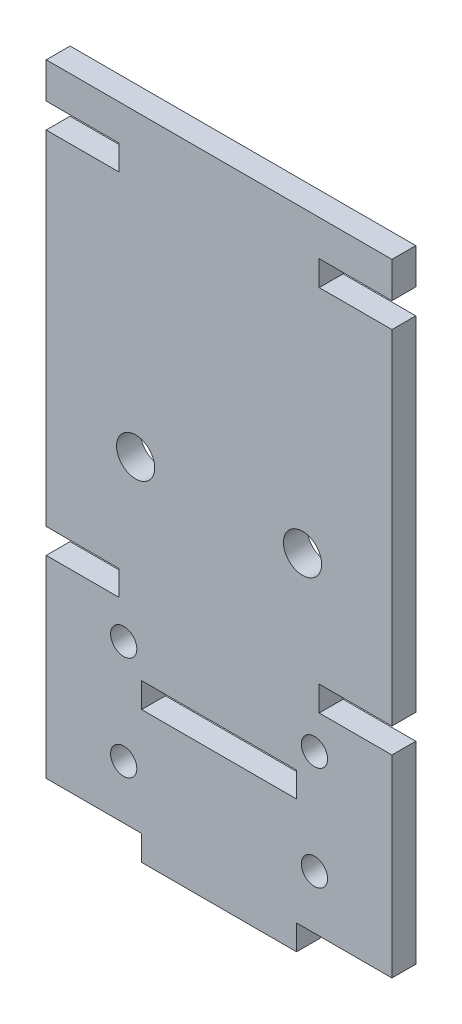
ISO-10303-21;
HEADER;
FILE_DESCRIPTION(('STEP AP214'),'2;1');
FILE_NAME('part.step','',(''),(''),'','','');
FILE_SCHEMA(('AUTOMOTIVE_DESIGN { 1 0 10303 214 1 1 1 1 }'));
ENDSEC;
DATA;
#1=APPLICATION_CONTEXT('core data for automotive mechanical design processes');
#2=APPLICATION_PROTOCOL_DEFINITION('international standard','automotive_design',2000,#1);
#3=PRODUCT_CONTEXT('',#1,'mechanical');
#4=PRODUCT('Part','Part','',(#3));
#5=PRODUCT_RELATED_PRODUCT_CATEGORY('part','',(#4));
#6=PRODUCT_DEFINITION_FORMATION('','',#4);
#7=PRODUCT_DEFINITION_CONTEXT('part definition',#1,'design');
#8=PRODUCT_DEFINITION('design','',#6,#7);
#9=PRODUCT_DEFINITION_SHAPE('','',#8);
#10=(LENGTH_UNIT() NAMED_UNIT(*) SI_UNIT(.MILLI.,.METRE.));
#11=(NAMED_UNIT(*) PLANE_ANGLE_UNIT() SI_UNIT($,.RADIAN.));
#12=(NAMED_UNIT(*) SI_UNIT($,.STERADIAN.) SOLID_ANGLE_UNIT());
#13=UNCERTAINTY_MEASURE_WITH_UNIT(LENGTH_MEASURE(1.E-05),#10,'distance_accuracy_value','');
#14=(GEOMETRIC_REPRESENTATION_CONTEXT(3) GLOBAL_UNCERTAINTY_ASSIGNED_CONTEXT((#13)) GLOBAL_UNIT_ASSIGNED_CONTEXT((#10,
#11,#12)) REPRESENTATION_CONTEXT('',''));
#15=CARTESIAN_POINT('',(0.,0.,0.));
#16=DIRECTION('',(0.,0.,1.));
#17=DIRECTION('',(1.,0.,0.));
#18=AXIS2_PLACEMENT_3D('',#15,#16,#17);
#19=CARTESIAN_POINT('',(0.,31.3004716981132,2.));
#20=DIRECTION('',(0.,-1.,0.));
#21=DIRECTION('',(0.,0.,-1.));
#22=AXIS2_PLACEMENT_3D('',#19,#20,#21);
#23=PLANE('',#22);
#24=DIRECTION('',(0.,0.,1.));
#25=VECTOR('',#24,1.);
#26=CARTESIAN_POINT('',(-6.14292452830189,31.3004716981132,0.));
#27=LINE('',#26,#25);
#28=CARTESIAN_POINT('',(-6.14292452830189,31.3004716981132,0.));
#29=VERTEX_POINT('',#28);
#30=CARTESIAN_POINT('',(-6.14292452830189,31.3004716981132,2.));
#31=VERTEX_POINT('',#30);
#32=EDGE_CURVE('E318',#29,#31,#27,.T.);
#33=ORIENTED_EDGE('',*,*,#32,.F.);
#34=DIRECTION('',(-1.,0.,0.));
#35=VECTOR('',#34,1.);
#36=CARTESIAN_POINT('',(0.,31.3004716981132,0.));
#37=LINE('',#36,#35);
#38=CARTESIAN_POINT('',(-12.2429245283019,31.3004716981132,0.));
#39=VERTEX_POINT('',#38);
#40=EDGE_CURVE('E429',#29,#39,#37,.T.);
#41=ORIENTED_EDGE('',*,*,#40,.T.);
#42=DIRECTION('',(0.,0.,-1.));
#43=VECTOR('',#42,1.);
#44=CARTESIAN_POINT('',(-12.2429245283019,31.3004716981132,2.));
#45=LINE('',#44,#43);
#46=CARTESIAN_POINT('',(-12.2429245283019,31.3004716981132,2.));
#47=VERTEX_POINT('',#46);
#48=EDGE_CURVE('E411',#47,#39,#45,.T.);
#49=ORIENTED_EDGE('',*,*,#48,.F.);
#50=DIRECTION('',(-1.,0.,0.));
#51=VECTOR('',#50,1.);
#52=CARTESIAN_POINT('',(0.,31.3004716981132,2.));
#53=LINE('',#52,#51);
#54=EDGE_CURVE('E395',#31,#47,#53,.T.);
#55=ORIENTED_EDGE('',*,*,#54,.F.);
#56=EDGE_LOOP('',(#33,#41,#49,#55));
#57=FACE_BOUND('',#56,.T.);
#58=ADVANCED_FACE('F45',(#57),#23,.F.);
#59=CARTESIAN_POINT('',(-12.2429245283019,0.,2.));
#60=DIRECTION('',(1.,0.,0.));
#61=DIRECTION('',(0.,1.,0.));
#62=AXIS2_PLACEMENT_3D('',#59,#60,#61);
#63=PLANE('',#62);
#64=DIRECTION('',(0.,0.,1.));
#65=VECTOR('',#64,1.);
#66=CARTESIAN_POINT('',(-12.2429245283019,0.400471698113226,0.));
#67=LINE('',#66,#65);
#68=CARTESIAN_POINT('',(-12.2429245283019,0.400471698113226,0.));
#69=VERTEX_POINT('',#68);
#70=CARTESIAN_POINT('',(-12.2429245283019,0.400471698113226,2.));
#71=VERTEX_POINT('',#70);
#72=EDGE_CURVE('E350',#69,#71,#67,.T.);
#73=ORIENTED_EDGE('',*,*,#72,.F.);
#74=DIRECTION('',(0.,-1.,0.));
#75=VECTOR('',#74,1.);
#76=CARTESIAN_POINT('',(-12.2429245283019,0.,0.));
#77=LINE('',#76,#75);
#78=CARTESIAN_POINT('',(-12.2429245283019,-15.7995283018868,0.));
#79=VERTEX_POINT('',#78);
#80=EDGE_CURVE('E348',#69,#79,#77,.T.);
#81=ORIENTED_EDGE('',*,*,#80,.T.);
#82=DIRECTION('',(0.,0.,-1.));
#83=VECTOR('',#82,1.);
#84=CARTESIAN_POINT('',(-12.2429245283019,-15.7995283018868,2.));
#85=LINE('',#84,#83);
#86=CARTESIAN_POINT('',(-12.2429245283019,-15.7995283018868,2.));
#87=VERTEX_POINT('',#86);
#88=EDGE_CURVE('E449',#87,#79,#85,.T.);
#89=ORIENTED_EDGE('',*,*,#88,.F.);
#90=DIRECTION('',(0.,-1.,0.));
#91=VECTOR('',#90,1.);
#92=CARTESIAN_POINT('',(-12.2429245283019,0.,2.));
#93=LINE('',#92,#91);
#94=EDGE_CURVE('E382',#71,#87,#93,.T.);
#95=ORIENTED_EDGE('',*,*,#94,.F.);
#96=EDGE_LOOP('',(#73,#81,#89,#95));
#97=FACE_BOUND('',#96,.T.);
#98=ADVANCED_FACE('F494',(#97),#63,.F.);
#99=CARTESIAN_POINT('',(16.7570754716981,0.,2.));
#100=DIRECTION('',(-1.,0.,0.));
#101=DIRECTION('',(0.,-1.,0.));
#102=AXIS2_PLACEMENT_3D('',#99,#100,#101);
#103=PLANE('',#102);
#104=DIRECTION('',(0.,1.,0.));
#105=VECTOR('',#104,1.);
#106=CARTESIAN_POINT('',(16.7570754716981,0.,2.));
#107=LINE('',#106,#105);
#108=CARTESIAN_POINT('',(16.7570754716981,2.50047169811322,2.));
#109=VERTEX_POINT('',#108);
#110=CARTESIAN_POINT('',(16.7570754716981,31.3004716981132,2.));
#111=VERTEX_POINT('',#110);
#112=EDGE_CURVE('E396',#109,#111,#107,.T.);
#113=ORIENTED_EDGE('',*,*,#112,.F.);
#114=DIRECTION('',(0.,0.,1.));
#115=VECTOR('',#114,1.);
#116=CARTESIAN_POINT('',(16.7570754716981,2.50047169811322,0.));
#117=LINE('',#116,#115);
#118=CARTESIAN_POINT('',(16.7570754716981,2.50047169811322,0.));
#119=VERTEX_POINT('',#118);
#120=EDGE_CURVE('E328',#119,#109,#117,.T.);
#121=ORIENTED_EDGE('',*,*,#120,.F.);
#122=DIRECTION('',(0.,1.,0.));
#123=VECTOR('',#122,1.);
#124=CARTESIAN_POINT('',(16.7570754716981,0.,0.));
#125=LINE('',#124,#123);
#126=CARTESIAN_POINT('',(16.7570754716981,31.3004716981132,0.));
#127=VERTEX_POINT('',#126);
#128=EDGE_CURVE('E430',#119,#127,#125,.T.);
#129=ORIENTED_EDGE('',*,*,#128,.T.);
#130=DIRECTION('',(0.,0.,-1.));
#131=VECTOR('',#130,1.);
#132=CARTESIAN_POINT('',(16.7570754716981,31.3004716981132,2.));
#133=LINE('',#132,#131);
#134=EDGE_CURVE('E454',#111,#127,#133,.T.);
#135=ORIENTED_EDGE('',*,*,#134,.F.);
#136=EDGE_LOOP('',(#113,#121,#129,#135));
#137=FACE_BOUND('',#136,.T.);
#138=ADVANCED_FACE('F503',(#137),#103,.F.);
#139=CARTESIAN_POINT('',(0.,-4.69952830188677,2.));
#140=DIRECTION('',(0.,-1.,0.));
#141=DIRECTION('',(0.,0.,-1.));
#142=AXIS2_PLACEMENT_3D('',#139,#140,#141);
#143=PLANE('',#142);
#144=DIRECTION('',(-1.,0.,0.));
#145=VECTOR('',#144,1.);
#146=CARTESIAN_POINT('',(0.,-4.69952830188677,0.));
#147=LINE('',#146,#145);
#148=CARTESIAN_POINT('',(8.7570754716981,-4.69952830188677,0.));
#149=VERTEX_POINT('',#148);
#150=CARTESIAN_POINT('',(-4.24292452830188,-4.69952830188677,0.));
#151=VERTEX_POINT('',#150);
#152=EDGE_CURVE('E434',#149,#151,#147,.T.);
#153=ORIENTED_EDGE('',*,*,#152,.F.);
#154=DIRECTION('',(0.,0.,-1.));
#155=VECTOR('',#154,1.);
#156=CARTESIAN_POINT('',(8.7570754716981,-4.69952830188677,2.));
#157=LINE('',#156,#155);
#158=CARTESIAN_POINT('',(8.7570754716981,-4.69952830188677,2.));
#159=VERTEX_POINT('',#158);
#160=EDGE_CURVE('E11',#159,#149,#157,.T.);
#161=ORIENTED_EDGE('',*,*,#160,.F.);
#162=DIRECTION('',(-1.,0.,0.));
#163=VECTOR('',#162,1.);
#164=CARTESIAN_POINT('',(0.,-4.69952830188677,2.));
#165=LINE('',#164,#163);
#166=CARTESIAN_POINT('',(-4.24292452830188,-4.69952830188677,2.));
#167=VERTEX_POINT('',#166);
#168=EDGE_CURVE('E400',#159,#167,#165,.T.);
#169=ORIENTED_EDGE('',*,*,#168,.T.);
#170=DIRECTION('',(0.,0.,-1.));
#171=VECTOR('',#170,1.);
#172=CARTESIAN_POINT('',(-4.24292452830188,-4.69952830188677,2.));
#173=LINE('',#172,#171);
#174=EDGE_CURVE('E446',#167,#151,#173,.T.);
#175=ORIENTED_EDGE('',*,*,#174,.T.);
#176=EDGE_LOOP('',(#153,#161,#169,#175));
#177=FACE_BOUND('',#176,.T.);
#178=ADVANCED_FACE('F780',(#177),#143,.T.);
#179=CARTESIAN_POINT('',(8.7570754716981,0.,2.));
#180=DIRECTION('',(1.,0.,0.));
#181=DIRECTION('',(0.,0.,-1.));
#182=AXIS2_PLACEMENT_3D('',#179,#180,#181);
#183=PLANE('',#182);
#184=DIRECTION('',(0.,-1.,0.));
#185=VECTOR('',#184,1.);
#186=CARTESIAN_POINT('',(8.7570754716981,0.,0.));
#187=LINE('',#186,#185);
#188=CARTESIAN_POINT('',(8.7570754716981,-6.79952830188677,0.));
#189=VERTEX_POINT('',#188);
#190=EDGE_CURVE('E437',#149,#189,#187,.T.);
#191=ORIENTED_EDGE('',*,*,#190,.T.);
#192=DIRECTION('',(0.,0.,-1.));
#193=VECTOR('',#192,1.);
#194=CARTESIAN_POINT('',(8.7570754716981,-6.79952830188677,2.));
#195=LINE('',#194,#193);
#196=CARTESIAN_POINT('',(8.7570754716981,-6.79952830188677,2.));
#197=VERTEX_POINT('',#196);
#198=EDGE_CURVE('E54',#197,#189,#195,.T.);
#199=ORIENTED_EDGE('',*,*,#198,.F.);
#200=DIRECTION('',(0.,-1.,0.));
#201=VECTOR('',#200,1.);
#202=CARTESIAN_POINT('',(8.7570754716981,0.,2.));
#203=LINE('',#202,#201);
#204=EDGE_CURVE('E403',#159,#197,#203,.T.);
#205=ORIENTED_EDGE('',*,*,#204,.F.);
#206=ORIENTED_EDGE('',*,*,#160,.T.);
#207=EDGE_LOOP('',(#191,#199,#205,#206));
#208=FACE_BOUND('',#207,.T.);
#209=ADVANCED_FACE('F871',(#208),#183,.F.);
#210=CARTESIAN_POINT('',(0.,-6.79952830188677,2.));
#211=DIRECTION('',(0.,1.,0.));
#212=DIRECTION('',(0.,0.,1.));
#213=AXIS2_PLACEMENT_3D('',#210,#211,#212);
#214=PLANE('',#213);
#215=DIRECTION('',(1.,0.,0.));
#216=VECTOR('',#215,1.);
#217=CARTESIAN_POINT('',(0.,-6.79952830188677,0.));
#218=LINE('',#217,#216);
#219=CARTESIAN_POINT('',(-4.24292452830188,-6.79952830188677,0.));
#220=VERTEX_POINT('',#219);
#221=EDGE_CURVE('E440',#220,#189,#218,.T.);
#222=ORIENTED_EDGE('',*,*,#221,.F.);
#223=DIRECTION('',(0.,0.,-1.));
#224=VECTOR('',#223,1.);
#225=CARTESIAN_POINT('',(-4.24292452830188,-6.79952830188677,2.));
#226=LINE('',#225,#224);
#227=CARTESIAN_POINT('',(-4.24292452830188,-6.79952830188677,2.));
#228=VERTEX_POINT('',#227);
#229=EDGE_CURVE('E448',#228,#220,#226,.T.);
#230=ORIENTED_EDGE('',*,*,#229,.F.);
#231=DIRECTION('',(1.,0.,0.));
#232=VECTOR('',#231,1.);
#233=CARTESIAN_POINT('',(0.,-6.79952830188677,2.));
#234=LINE('',#233,#232);
#235=EDGE_CURVE('E405',#228,#197,#234,.T.);
#236=ORIENTED_EDGE('',*,*,#235,.T.);
#237=ORIENTED_EDGE('',*,*,#198,.T.);
#238=EDGE_LOOP('',(#222,#230,#236,#237));
#239=FACE_BOUND('',#238,.T.);
#240=ADVANCED_FACE('F862',(#239),#214,.T.);
#241=CARTESIAN_POINT('',(-12.2429245283019,2.50047169811322,0.));
#242=VERTEX_POINT('',#241);
#243=EDGE_CURVE('E412',#39,#242,#77,.T.);
#244=ORIENTED_EDGE('',*,*,#243,.T.);
#245=DIRECTION('',(0.,0.,1.));
#246=VECTOR('',#245,1.);
#247=CARTESIAN_POINT('',(-12.2429245283019,2.50047169811322,0.));
#248=LINE('',#247,#246);
#249=CARTESIAN_POINT('',(-12.2429245283019,2.50047169811322,2.));
#250=VERTEX_POINT('',#249);
#251=EDGE_CURVE('E337',#242,#250,#248,.T.);
#252=ORIENTED_EDGE('',*,*,#251,.T.);
#253=EDGE_CURVE('E378',#47,#250,#93,.T.);
#254=ORIENTED_EDGE('',*,*,#253,.F.);
#255=ORIENTED_EDGE('',*,*,#48,.T.);
#256=EDGE_LOOP('',(#244,#252,#254,#255));
#257=FACE_BOUND('',#256,.T.);
#258=ADVANCED_FACE('F47',(#257),#63,.F.);
#259=CARTESIAN_POINT('',(0.,-15.7995283018868,2.));
#260=DIRECTION('',(0.,1.,0.));
#261=DIRECTION('',(-1.,0.,0.));
#262=AXIS2_PLACEMENT_3D('',#259,#260,#261);
#263=PLANE('',#262);
#264=DIRECTION('',(1.,0.,0.));
#265=VECTOR('',#264,1.);
#266=CARTESIAN_POINT('',(0.,-15.7995283018868,0.));
#267=LINE('',#266,#265);
#268=CARTESIAN_POINT('',(-4.24292452830188,-15.7995283018868,0.));
#269=VERTEX_POINT('',#268);
#270=EDGE_CURVE('E415',#79,#269,#267,.T.);
#271=ORIENTED_EDGE('',*,*,#270,.T.);
#272=DIRECTION('',(0.,0.,-1.));
#273=VECTOR('',#272,1.);
#274=CARTESIAN_POINT('',(-4.24292452830188,-15.7995283018868,2.));
#275=LINE('',#274,#273);
#276=CARTESIAN_POINT('',(-4.24292452830188,-15.7995283018868,2.));
#277=VERTEX_POINT('',#276);
#278=EDGE_CURVE('E467',#277,#269,#275,.T.);
#279=ORIENTED_EDGE('',*,*,#278,.F.);
#280=DIRECTION('',(1.,0.,0.));
#281=VECTOR('',#280,1.);
#282=CARTESIAN_POINT('',(0.,-15.7995283018868,2.));
#283=LINE('',#282,#281);
#284=EDGE_CURVE('E381',#87,#277,#283,.T.);
#285=ORIENTED_EDGE('',*,*,#284,.F.);
#286=ORIENTED_EDGE('',*,*,#88,.T.);
#287=EDGE_LOOP('',(#271,#279,#285,#286));
#288=FACE_BOUND('',#287,.T.);
#289=ADVANCED_FACE('F565',(#288),#263,.F.);
#290=CARTESIAN_POINT('',(-4.24292452830186,0.,2.));
#291=DIRECTION('',(1.,0.,0.));
#292=DIRECTION('',(0.,1.,0.));
#293=AXIS2_PLACEMENT_3D('',#290,#291,#292);
#294=PLANE('',#293);
#295=DIRECTION('',(0.,-1.,0.));
#296=VECTOR('',#295,1.);
#297=CARTESIAN_POINT('',(-4.24292452830186,0.,0.));
#298=LINE('',#297,#296);
#299=CARTESIAN_POINT('',(-4.24292452830188,-17.8995283018868,0.));
#300=VERTEX_POINT('',#299);
#301=EDGE_CURVE('E417',#269,#300,#298,.T.);
#302=ORIENTED_EDGE('',*,*,#301,.T.);
#303=DIRECTION('',(0.,0.,-1.));
#304=VECTOR('',#303,1.);
#305=CARTESIAN_POINT('',(-4.24292452830188,-17.8995283018868,2.));
#306=LINE('',#305,#304);
#307=CARTESIAN_POINT('',(-4.24292452830188,-17.8995283018868,2.));
#308=VERTEX_POINT('',#307);
#309=EDGE_CURVE('E464',#308,#300,#306,.T.);
#310=ORIENTED_EDGE('',*,*,#309,.F.);
#311=DIRECTION('',(0.,-1.,0.));
#312=VECTOR('',#311,1.);
#313=CARTESIAN_POINT('',(-4.24292452830186,0.,2.));
#314=LINE('',#313,#312);
#315=EDGE_CURVE('E384',#277,#308,#314,.T.);
#316=ORIENTED_EDGE('',*,*,#315,.F.);
#317=ORIENTED_EDGE('',*,*,#278,.T.);
#318=EDGE_LOOP('',(#302,#310,#316,#317));
#319=FACE_BOUND('',#318,.T.);
#320=ADVANCED_FACE('F561',(#319),#294,.F.);
#321=CARTESIAN_POINT('',(0.,-17.8995283018868,2.));
#322=DIRECTION('',(0.,1.,0.));
#323=DIRECTION('',(0.,0.,1.));
#324=AXIS2_PLACEMENT_3D('',#321,#322,#323);
#325=PLANE('',#324);
#326=DIRECTION('',(1.,0.,0.));
#327=VECTOR('',#326,1.);
#328=CARTESIAN_POINT('',(0.,-17.8995283018868,0.));
#329=LINE('',#328,#327);
#330=CARTESIAN_POINT('',(8.7570754716981,-17.8995283018868,0.));
#331=VERTEX_POINT('',#330);
#332=EDGE_CURVE('E420',#300,#331,#329,.T.);
#333=ORIENTED_EDGE('',*,*,#332,.T.);
#334=DIRECTION('',(0.,0.,-1.));
#335=VECTOR('',#334,1.);
#336=CARTESIAN_POINT('',(8.7570754716981,-17.8995283018868,2.));
#337=LINE('',#336,#335);
#338=CARTESIAN_POINT('',(8.7570754716981,-17.8995283018868,2.));
#339=VERTEX_POINT('',#338);
#340=EDGE_CURVE('E462',#339,#331,#337,.T.);
#341=ORIENTED_EDGE('',*,*,#340,.F.);
#342=DIRECTION('',(1.,0.,0.));
#343=VECTOR('',#342,1.);
#344=CARTESIAN_POINT('',(0.,-17.8995283018868,2.));
#345=LINE('',#344,#343);
#346=EDGE_CURVE('E387',#308,#339,#345,.T.);
#347=ORIENTED_EDGE('',*,*,#346,.F.);
#348=ORIENTED_EDGE('',*,*,#309,.T.);
#349=EDGE_LOOP('',(#333,#341,#347,#348));
#350=FACE_BOUND('',#349,.T.);
#351=ADVANCED_FACE('F557',(#350),#325,.F.);
#352=CARTESIAN_POINT('',(8.7570754716981,0.,2.));
#353=DIRECTION('',(1.,0.,0.));
#354=DIRECTION('',(0.,0.,-1.));
#355=AXIS2_PLACEMENT_3D('',#352,#353,#354);
#356=PLANE('',#355);
#357=DIRECTION('',(0.,-1.,0.));
#358=VECTOR('',#357,1.);
#359=CARTESIAN_POINT('',(8.7570754716981,0.,0.));
#360=LINE('',#359,#358);
#361=CARTESIAN_POINT('',(8.7570754716981,-15.7995283018868,0.));
#362=VERTEX_POINT('',#361);
#363=EDGE_CURVE('E423',#362,#331,#360,.T.);
#364=ORIENTED_EDGE('',*,*,#363,.F.);
#365=DIRECTION('',(0.,0.,-1.));
#366=VECTOR('',#365,1.);
#367=CARTESIAN_POINT('',(8.7570754716981,-15.7995283018868,2.));
#368=LINE('',#367,#366);
#369=CARTESIAN_POINT('',(8.7570754716981,-15.7995283018868,2.));
#370=VERTEX_POINT('',#369);
#371=EDGE_CURVE('E460',#370,#362,#368,.T.);
#372=ORIENTED_EDGE('',*,*,#371,.F.);
#373=DIRECTION('',(0.,-1.,0.));
#374=VECTOR('',#373,1.);
#375=CARTESIAN_POINT('',(8.7570754716981,0.,2.));
#376=LINE('',#375,#374);
#377=EDGE_CURVE('E389',#370,#339,#376,.T.);
#378=ORIENTED_EDGE('',*,*,#377,.T.);
#379=ORIENTED_EDGE('',*,*,#340,.T.);
#380=EDGE_LOOP('',(#364,#372,#378,#379));
#381=FACE_BOUND('',#380,.T.);
#382=ADVANCED_FACE('F552',(#381),#356,.T.);
#383=CARTESIAN_POINT('',(16.7570754716981,-15.7995283018868,0.));
#384=VERTEX_POINT('',#383);
#385=EDGE_CURVE('E418',#362,#384,#267,.T.);
#386=ORIENTED_EDGE('',*,*,#385,.T.);
#387=DIRECTION('',(0.,0.,-1.));
#388=VECTOR('',#387,1.);
#389=CARTESIAN_POINT('',(16.7570754716981,-15.7995283018868,2.));
#390=LINE('',#389,#388);
#391=CARTESIAN_POINT('',(16.7570754716981,-15.7995283018868,2.));
#392=VERTEX_POINT('',#391);
#393=EDGE_CURVE('E457',#392,#384,#390,.T.);
#394=ORIENTED_EDGE('',*,*,#393,.F.);
#395=EDGE_CURVE('E385',#370,#392,#283,.T.);
#396=ORIENTED_EDGE('',*,*,#395,.F.);
#397=ORIENTED_EDGE('',*,*,#371,.T.);
#398=EDGE_LOOP('',(#386,#394,#396,#397));
#399=FACE_BOUND('',#398,.T.);
#400=ADVANCED_FACE('F519',(#399),#263,.F.);
#401=CARTESIAN_POINT('',(16.7570754716981,0.400471698113226,0.));
#402=VERTEX_POINT('',#401);
#403=EDGE_CURVE('E426',#384,#402,#125,.T.);
#404=ORIENTED_EDGE('',*,*,#403,.T.);
#405=DIRECTION('',(0.,0.,1.));
#406=VECTOR('',#405,1.);
#407=CARTESIAN_POINT('',(16.7570754716981,0.400471698113226,0.));
#408=LINE('',#407,#406);
#409=CARTESIAN_POINT('',(16.7570754716981,0.400471698113226,2.));
#410=VERTEX_POINT('',#409);
#411=EDGE_CURVE('E359',#402,#410,#408,.T.);
#412=ORIENTED_EDGE('',*,*,#411,.T.);
#413=EDGE_CURVE('E392',#392,#410,#107,.T.);
#414=ORIENTED_EDGE('',*,*,#413,.F.);
#415=ORIENTED_EDGE('',*,*,#393,.T.);
#416=EDGE_LOOP('',(#404,#412,#414,#415));
#417=FACE_BOUND('',#416,.T.);
#418=ADVANCED_FACE('F509',(#417),#103,.F.);
#419=CARTESIAN_POINT('',(10.6570754716981,31.3004716981132,0.));
#420=VERTEX_POINT('',#419);
#421=EDGE_CURVE('E431',#127,#420,#37,.T.);
#422=ORIENTED_EDGE('',*,*,#421,.T.);
#423=DIRECTION('',(0.,0.,1.));
#424=VECTOR('',#423,1.);
#425=CARTESIAN_POINT('',(10.6570754716981,31.3004716981132,0.));
#426=LINE('',#425,#424);
#427=CARTESIAN_POINT('',(10.6570754716981,31.3004716981132,2.));
#428=VERTEX_POINT('',#427);
#429=EDGE_CURVE('E322',#420,#428,#426,.T.);
#430=ORIENTED_EDGE('',*,*,#429,.T.);
#431=EDGE_CURVE('E397',#111,#428,#53,.T.);
#432=ORIENTED_EDGE('',*,*,#431,.F.);
#433=ORIENTED_EDGE('',*,*,#134,.T.);
#434=EDGE_LOOP('',(#422,#430,#432,#433));
#435=FACE_BOUND('',#434,.T.);
#436=ADVANCED_FACE('F497',(#435),#23,.F.);
#437=CARTESIAN_POINT('',(-4.24292452830188,0.,2.));
#438=DIRECTION('',(1.,0.,0.));
#439=DIRECTION('',(0.,1.,0.));
#440=AXIS2_PLACEMENT_3D('',#437,#438,#439);
#441=PLANE('',#440);
#442=DIRECTION('',(0.,-1.,0.));
#443=VECTOR('',#442,1.);
#444=CARTESIAN_POINT('',(-4.24292452830188,0.,0.));
#445=LINE('',#444,#443);
#446=EDGE_CURVE('E443',#151,#220,#445,.T.);
#447=ORIENTED_EDGE('',*,*,#446,.F.);
#448=ORIENTED_EDGE('',*,*,#174,.F.);
#449=DIRECTION('',(0.,-1.,0.));
#450=VECTOR('',#449,1.);
#451=CARTESIAN_POINT('',(-4.24292452830188,0.,2.));
#452=LINE('',#451,#450);
#453=EDGE_CURVE('E408',#167,#228,#452,.T.);
#454=ORIENTED_EDGE('',*,*,#453,.T.);
#455=ORIENTED_EDGE('',*,*,#229,.T.);
#456=EDGE_LOOP('',(#447,#448,#454,#455));
#457=FACE_BOUND('',#456,.T.);
#458=ADVANCED_FACE('F508',(#457),#441,.T.);
#459=CARTESIAN_POINT('',(0.,0.,2.));
#460=DIRECTION('',(0.,0.,1.));
#461=DIRECTION('',(1.,0.,0.));
#462=AXIS2_PLACEMENT_3D('',#459,#460,#461);
#463=PLANE('',#462);
#464=CARTESIAN_POINT('',(10.2570754716981,-11.2995283018868,2.));
#465=DIRECTION('',(0.,0.,1.));
#466=DIRECTION('',(1.,0.,0.));
#467=AXIS2_PLACEMENT_3D('',#464,#465,#466);
#468=CIRCLE('',#467,1.1);
#469=CARTESIAN_POINT('',(11.3570754716981,-11.2995283018868,2.));
#470=VERTEX_POINT('',#469);
#471=EDGE_CURVE('E283',#470,#470,#468,.T.);
#472=ORIENTED_EDGE('',*,*,#471,.F.);
#473=EDGE_LOOP('',(#472));
#474=FACE_BOUND('',#473,.T.);
#475=CARTESIAN_POINT('',(-5.74292452830189,-11.2995283018868,2.));
#476=DIRECTION('',(0.,0.,1.));
#477=DIRECTION('',(-1.,0.,0.));
#478=AXIS2_PLACEMENT_3D('',#475,#476,#477);
#479=CIRCLE('',#478,1.1);
#480=CARTESIAN_POINT('',(-6.84292452830189,-11.2995283018868,2.));
#481=VERTEX_POINT('',#480);
#482=EDGE_CURVE('E279',#481,#481,#479,.T.);
#483=ORIENTED_EDGE('',*,*,#482,.F.);
#484=EDGE_LOOP('',(#483));
#485=FACE_BOUND('',#484,.T.);
#486=CARTESIAN_POINT('',(10.2570754716981,-2.59952830188678,2.));
#487=DIRECTION('',(0.,0.,1.));
#488=DIRECTION('',(1.,0.,0.));
#489=AXIS2_PLACEMENT_3D('',#486,#487,#488);
#490=CIRCLE('',#489,1.1);
#491=CARTESIAN_POINT('',(11.3570754716981,-2.59952830188678,2.));
#492=VERTEX_POINT('',#491);
#493=EDGE_CURVE('E298',#492,#492,#490,.T.);
#494=ORIENTED_EDGE('',*,*,#493,.F.);
#495=EDGE_LOOP('',(#494));
#496=FACE_BOUND('',#495,.T.);
#497=CARTESIAN_POINT('',(-5.74292452830189,-2.59952830188678,2.));
#498=DIRECTION('',(0.,0.,1.));
#499=DIRECTION('',(1.,0.,0.));
#500=AXIS2_PLACEMENT_3D('',#497,#498,#499);
#501=CIRCLE('',#500,1.1);
#502=CARTESIAN_POINT('',(-4.64292452830188,-2.59952830188678,2.));
#503=VERTEX_POINT('',#502);
#504=EDGE_CURVE('E292',#503,#503,#501,.T.);
#505=ORIENTED_EDGE('',*,*,#504,.F.);
#506=EDGE_LOOP('',(#505));
#507=FACE_BOUND('',#506,.T.);
#508=CARTESIAN_POINT('',(-4.74292452830189,11.3004716981132,2.));
#509=DIRECTION('',(0.,0.,1.));
#510=DIRECTION('',(1.,0.,0.));
#511=AXIS2_PLACEMENT_3D('',#508,#509,#510);
#512=CIRCLE('',#511,1.6);
#513=CARTESIAN_POINT('',(-3.14292452830189,11.3004716981132,2.));
#514=VERTEX_POINT('',#513);
#515=EDGE_CURVE('E306',#514,#514,#512,.T.);
#516=ORIENTED_EDGE('',*,*,#515,.F.);
#517=EDGE_LOOP('',(#516));
#518=FACE_BOUND('',#517,.T.);
#519=CARTESIAN_POINT('',(9.25707547169811,11.3004716981132,2.));
#520=DIRECTION('',(0.,0.,1.));
#521=DIRECTION('',(-1.,0.,0.));
#522=AXIS2_PLACEMENT_3D('',#519,#520,#521);
#523=CIRCLE('',#522,1.6);
#524=CARTESIAN_POINT('',(7.65707547169811,11.3004716981132,2.));
#525=VERTEX_POINT('',#524);
#526=EDGE_CURVE('E309',#525,#525,#523,.T.);
#527=ORIENTED_EDGE('',*,*,#526,.F.);
#528=EDGE_LOOP('',(#527));
#529=FACE_BOUND('',#528,.T.);
#530=DIRECTION('',(-1.,0.,0.));
#531=VECTOR('',#530,1.);
#532=CARTESIAN_POINT('',(-6.14292452830189,2.50047169811322,2.));
#533=LINE('',#532,#531);
#534=CARTESIAN_POINT('',(-6.14292452830189,2.50047169811322,2.));
#535=VERTEX_POINT('',#534);
#536=EDGE_CURVE('E338',#535,#250,#533,.T.);
#537=ORIENTED_EDGE('',*,*,#536,.F.);
#538=DIRECTION('',(0.,-1.,0.));
#539=VECTOR('',#538,1.);
#540=CARTESIAN_POINT('',(-6.14292452830189,2.50047169811322,2.));
#541=LINE('',#540,#539);
#542=CARTESIAN_POINT('',(-6.14292452830189,0.400471698113226,2.));
#543=VERTEX_POINT('',#542);
#544=EDGE_CURVE('E333',#535,#543,#541,.T.);
#545=ORIENTED_EDGE('',*,*,#544,.T.);
#546=DIRECTION('',(-1.,0.,0.));
#547=VECTOR('',#546,1.);
#548=CARTESIAN_POINT('',(-6.14292452830189,0.400471698113226,2.));
#549=LINE('',#548,#547);
#550=EDGE_CURVE('E340',#543,#71,#549,.T.);
#551=ORIENTED_EDGE('',*,*,#550,.T.);
#552=ORIENTED_EDGE('',*,*,#94,.T.);
#553=ORIENTED_EDGE('',*,*,#284,.T.);
#554=ORIENTED_EDGE('',*,*,#315,.T.);
#555=ORIENTED_EDGE('',*,*,#346,.T.);
#556=ORIENTED_EDGE('',*,*,#377,.F.);
#557=ORIENTED_EDGE('',*,*,#395,.T.);
#558=ORIENTED_EDGE('',*,*,#413,.T.);
#559=DIRECTION('',(1.,0.,0.));
#560=VECTOR('',#559,1.);
#561=CARTESIAN_POINT('',(10.6570754716981,0.400471698113226,2.));
#562=LINE('',#561,#560);
#563=CARTESIAN_POINT('',(10.6570754716981,0.400471698113226,2.));
#564=VERTEX_POINT('',#563);
#565=EDGE_CURVE('E363',#564,#410,#562,.T.);
#566=ORIENTED_EDGE('',*,*,#565,.F.);
#567=DIRECTION('',(0.,-1.,0.));
#568=VECTOR('',#567,1.);
#569=CARTESIAN_POINT('',(10.6570754716981,2.50047169811322,2.));
#570=LINE('',#569,#568);
#571=CARTESIAN_POINT('',(10.6570754716981,2.50047169811322,2.));
#572=VERTEX_POINT('',#571);
#573=EDGE_CURVE('E365',#572,#564,#570,.T.);
#574=ORIENTED_EDGE('',*,*,#573,.F.);
#575=DIRECTION('',(-1.,0.,0.));
#576=VECTOR('',#575,1.);
#577=CARTESIAN_POINT('',(16.7570754716981,2.50047169811322,2.));
#578=LINE('',#577,#576);
#579=EDGE_CURVE('E341',#109,#572,#578,.T.);
#580=ORIENTED_EDGE('',*,*,#579,.F.);
#581=ORIENTED_EDGE('',*,*,#112,.T.);
#582=ORIENTED_EDGE('',*,*,#431,.T.);
#583=DIRECTION('',(0.,1.,0.));
#584=VECTOR('',#583,1.);
#585=CARTESIAN_POINT('',(10.6570754716981,31.3004716981132,2.));
#586=LINE('',#585,#584);
#587=CARTESIAN_POINT('',(10.6570754716981,33.4004716981132,2.));
#588=VERTEX_POINT('',#587);
#589=EDGE_CURVE('E62',#428,#588,#586,.T.);
#590=ORIENTED_EDGE('',*,*,#589,.T.);
#591=DIRECTION('',(1.,0.,0.));
#592=VECTOR('',#591,1.);
#593=CARTESIAN_POINT('',(-6.14292452830189,33.4004716981132,2.));
#594=LINE('',#593,#592);
#595=CARTESIAN_POINT('',(16.7570754716981,33.4004716981132,2.));
#596=VERTEX_POINT('',#595);
#597=EDGE_CURVE('E274',#588,#596,#594,.T.);
#598=ORIENTED_EDGE('',*,*,#597,.T.);
#599=DIRECTION('',(0.,1.,0.));
#600=VECTOR('',#599,1.);
#601=CARTESIAN_POINT('',(16.7570754716981,36.4004716981132,2.));
#602=LINE('',#601,#600);
#603=CARTESIAN_POINT('',(16.7570754716981,36.4004716981132,2.));
#604=VERTEX_POINT('',#603);
#605=EDGE_CURVE('E250',#596,#604,#602,.T.);
#606=ORIENTED_EDGE('',*,*,#605,.T.);
#607=DIRECTION('',(-1.,0.,0.));
#608=VECTOR('',#607,1.);
#609=CARTESIAN_POINT('',(-12.2429245283019,36.4004716981132,2.));
#610=LINE('',#609,#608);
#611=CARTESIAN_POINT('',(-12.2429245283019,36.4004716981132,2.));
#612=VERTEX_POINT('',#611);
#613=EDGE_CURVE('E268',#604,#612,#610,.T.);
#614=ORIENTED_EDGE('',*,*,#613,.T.);
#615=DIRECTION('',(0.,-1.,0.));
#616=VECTOR('',#615,1.);
#617=CARTESIAN_POINT('',(-12.2429245283019,33.4004716981132,2.));
#618=LINE('',#617,#616);
#619=CARTESIAN_POINT('',(-12.2429245283019,33.4004716981132,2.));
#620=VERTEX_POINT('',#619);
#621=EDGE_CURVE('E271',#612,#620,#618,.T.);
#622=ORIENTED_EDGE('',*,*,#621,.T.);
#623=CARTESIAN_POINT('',(-6.14292452830189,33.4004716981132,2.));
#624=VERTEX_POINT('',#623);
#625=EDGE_CURVE('E243',#620,#624,#594,.T.);
#626=ORIENTED_EDGE('',*,*,#625,.T.);
#627=DIRECTION('',(0.,1.,0.));
#628=VECTOR('',#627,1.);
#629=CARTESIAN_POINT('',(-6.14292452830189,31.3004716981132,2.));
#630=LINE('',#629,#628);
#631=EDGE_CURVE('E305',#31,#624,#630,.T.);
#632=ORIENTED_EDGE('',*,*,#631,.F.);
#633=ORIENTED_EDGE('',*,*,#54,.T.);
#634=ORIENTED_EDGE('',*,*,#253,.T.);
#635=EDGE_LOOP('',(#537,#545,#551,#552,#553,#554,#555,#556,#557,#558,#566,#574,#580,#581,#582,
#590,#598,#606,#614,#622,#626,#632,#633,#634));
#636=FACE_BOUND('',#635,.T.);
#637=ORIENTED_EDGE('',*,*,#168,.F.);
#638=ORIENTED_EDGE('',*,*,#204,.T.);
#639=ORIENTED_EDGE('',*,*,#235,.F.);
#640=ORIENTED_EDGE('',*,*,#453,.F.);
#641=EDGE_LOOP('',(#637,#638,#639,#640));
#642=FACE_BOUND('',#641,.T.);
#643=ADVANCED_FACE('F515',(#474,#485,#496,#507,#518,#529,#636,#642),#463,.T.);
#644=CARTESIAN_POINT('',(0.,0.,0.));
#645=DIRECTION('',(0.,0.,1.));
#646=DIRECTION('',(1.,0.,0.));
#647=AXIS2_PLACEMENT_3D('',#644,#645,#646);
#648=PLANE('',#647);
#649=CARTESIAN_POINT('',(10.2570754716981,-11.2995283018868,0.));
#650=DIRECTION('',(0.,0.,1.));
#651=DIRECTION('',(1.,0.,0.));
#652=AXIS2_PLACEMENT_3D('',#649,#650,#651);
#653=CIRCLE('',#652,1.1);
#654=CARTESIAN_POINT('',(11.3570754716981,-11.2995283018868,0.));
#655=VERTEX_POINT('',#654);
#656=EDGE_CURVE('E49',#655,#655,#653,.T.);
#657=ORIENTED_EDGE('',*,*,#656,.T.);
#658=EDGE_LOOP('',(#657));
#659=FACE_BOUND('',#658,.T.);
#660=CARTESIAN_POINT('',(-5.74292452830189,-11.2995283018868,0.));
#661=DIRECTION('',(0.,0.,1.));
#662=DIRECTION('',(1.,0.,0.));
#663=AXIS2_PLACEMENT_3D('',#660,#661,#662);
#664=CIRCLE('',#663,1.1);
#665=CARTESIAN_POINT('',(-4.64292452830188,-11.2995283018868,0.));
#666=VERTEX_POINT('',#665);
#667=EDGE_CURVE('E286',#666,#666,#664,.T.);
#668=ORIENTED_EDGE('',*,*,#667,.T.);
#669=EDGE_LOOP('',(#668));
#670=FACE_BOUND('',#669,.T.);
#671=CARTESIAN_POINT('',(10.2570754716981,-2.59952830188678,0.));
#672=DIRECTION('',(0.,0.,-1.));
#673=DIRECTION('',(-1.,0.,0.));
#674=AXIS2_PLACEMENT_3D('',#671,#672,#673);
#675=CIRCLE('',#674,1.1);
#676=CARTESIAN_POINT('',(9.15707547169811,-2.59952830188678,0.));
#677=VERTEX_POINT('',#676);
#678=EDGE_CURVE('E289',#677,#677,#675,.T.);
#679=ORIENTED_EDGE('',*,*,#678,.F.);
#680=EDGE_LOOP('',(#679));
#681=FACE_BOUND('',#680,.T.);
#682=CARTESIAN_POINT('',(-5.74292452830189,-2.59952830188678,0.));
#683=DIRECTION('',(0.,0.,-1.));
#684=DIRECTION('',(-1.,0.,0.));
#685=AXIS2_PLACEMENT_3D('',#682,#683,#684);
#686=CIRCLE('',#685,1.1);
#687=CARTESIAN_POINT('',(-6.84292452830189,-2.59952830188678,0.));
#688=VERTEX_POINT('',#687);
#689=EDGE_CURVE('E293',#688,#688,#686,.T.);
#690=ORIENTED_EDGE('',*,*,#689,.F.);
#691=EDGE_LOOP('',(#690));
#692=FACE_BOUND('',#691,.T.);
#693=CARTESIAN_POINT('',(-4.74292452830189,11.3004716981132,0.));
#694=DIRECTION('',(0.,0.,1.));
#695=DIRECTION('',(1.,0.,0.));
#696=AXIS2_PLACEMENT_3D('',#693,#694,#695);
#697=CIRCLE('',#696,1.6);
#698=CARTESIAN_POINT('',(-3.14292452830189,11.3004716981132,0.));
#699=VERTEX_POINT('',#698);
#700=EDGE_CURVE('E302',#699,#699,#697,.T.);
#701=ORIENTED_EDGE('',*,*,#700,.T.);
#702=EDGE_LOOP('',(#701));
#703=FACE_BOUND('',#702,.T.);
#704=CARTESIAN_POINT('',(9.25707547169811,11.3004716981132,0.));
#705=DIRECTION('',(0.,0.,1.));
#706=DIRECTION('',(-1.,0.,0.));
#707=AXIS2_PLACEMENT_3D('',#704,#705,#706);
#708=CIRCLE('',#707,1.6);
#709=CARTESIAN_POINT('',(7.65707547169811,11.3004716981132,0.));
#710=VERTEX_POINT('',#709);
#711=EDGE_CURVE('E301',#710,#710,#708,.T.);
#712=ORIENTED_EDGE('',*,*,#711,.T.);
#713=EDGE_LOOP('',(#712));
#714=FACE_BOUND('',#713,.T.);
#715=DIRECTION('',(0.,-1.,0.));
#716=VECTOR('',#715,1.);
#717=CARTESIAN_POINT('',(-6.14292452830189,2.50047169811322,0.));
#718=LINE('',#717,#716);
#719=CARTESIAN_POINT('',(-6.14292452830189,2.50047169811322,0.));
#720=VERTEX_POINT('',#719);
#721=CARTESIAN_POINT('',(-6.14292452830189,0.400471698113226,0.));
#722=VERTEX_POINT('',#721);
#723=EDGE_CURVE('E335',#720,#722,#718,.T.);
#724=ORIENTED_EDGE('',*,*,#723,.F.);
#725=DIRECTION('',(-1.,0.,0.));
#726=VECTOR('',#725,1.);
#727=CARTESIAN_POINT('',(-6.14292452830189,2.50047169811322,0.));
#728=LINE('',#727,#726);
#729=EDGE_CURVE('E329',#720,#242,#728,.T.);
#730=ORIENTED_EDGE('',*,*,#729,.T.);
#731=ORIENTED_EDGE('',*,*,#243,.F.);
#732=ORIENTED_EDGE('',*,*,#40,.F.);
#733=DIRECTION('',(0.,1.,0.));
#734=VECTOR('',#733,1.);
#735=CARTESIAN_POINT('',(-6.14292452830189,31.3004716981132,0.));
#736=LINE('',#735,#734);
#737=CARTESIAN_POINT('',(-6.14292452830189,33.4004716981132,0.));
#738=VERTEX_POINT('',#737);
#739=EDGE_CURVE('E314',#29,#738,#736,.T.);
#740=ORIENTED_EDGE('',*,*,#739,.T.);
#741=DIRECTION('',(1.,0.,0.));
#742=VECTOR('',#741,1.);
#743=CARTESIAN_POINT('',(16.7570754716981,33.4004716981132,0.));
#744=LINE('',#743,#742);
#745=CARTESIAN_POINT('',(-12.2429245283019,33.4004716981132,0.));
#746=VERTEX_POINT('',#745);
#747=EDGE_CURVE('E242',#746,#738,#744,.T.);
#748=ORIENTED_EDGE('',*,*,#747,.F.);
#749=DIRECTION('',(0.,-1.,0.));
#750=VECTOR('',#749,1.);
#751=CARTESIAN_POINT('',(-12.2429245283019,33.4004716981132,0.));
#752=LINE('',#751,#750);
#753=CARTESIAN_POINT('',(-12.2429245283019,36.4004716981132,0.));
#754=VERTEX_POINT('',#753);
#755=EDGE_CURVE('E252',#754,#746,#752,.T.);
#756=ORIENTED_EDGE('',*,*,#755,.F.);
#757=DIRECTION('',(-1.,0.,0.));
#758=VECTOR('',#757,1.);
#759=CARTESIAN_POINT('',(-12.2429245283019,36.4004716981132,0.));
#760=LINE('',#759,#758);
#761=CARTESIAN_POINT('',(16.7570754716981,36.4004716981132,0.));
#762=VERTEX_POINT('',#761);
#763=EDGE_CURVE('E260',#762,#754,#760,.T.);
#764=ORIENTED_EDGE('',*,*,#763,.F.);
#765=DIRECTION('',(0.,1.,0.));
#766=VECTOR('',#765,1.);
#767=CARTESIAN_POINT('',(16.7570754716981,36.4004716981132,0.));
#768=LINE('',#767,#766);
#769=CARTESIAN_POINT('',(16.7570754716981,33.4004716981132,0.));
#770=VERTEX_POINT('',#769);
#771=EDGE_CURVE('E248',#770,#762,#768,.T.);
#772=ORIENTED_EDGE('',*,*,#771,.F.);
#773=CARTESIAN_POINT('',(10.6570754716981,33.4004716981132,0.));
#774=VERTEX_POINT('',#773);
#775=EDGE_CURVE('E232',#774,#770,#744,.T.);
#776=ORIENTED_EDGE('',*,*,#775,.F.);
#777=DIRECTION('',(0.,1.,0.));
#778=VECTOR('',#777,1.);
#779=CARTESIAN_POINT('',(10.6570754716981,31.3004716981132,0.));
#780=LINE('',#779,#778);
#781=EDGE_CURVE('E316',#420,#774,#780,.T.);
#782=ORIENTED_EDGE('',*,*,#781,.F.);
#783=ORIENTED_EDGE('',*,*,#421,.F.);
#784=ORIENTED_EDGE('',*,*,#128,.F.);
#785=DIRECTION('',(-1.,0.,0.));
#786=VECTOR('',#785,1.);
#787=CARTESIAN_POINT('',(16.7570754716981,2.50047169811322,0.));
#788=LINE('',#787,#786);
#789=CARTESIAN_POINT('',(10.6570754716981,2.50047169811322,0.));
#790=VERTEX_POINT('',#789);
#791=EDGE_CURVE('E366',#119,#790,#788,.T.);
#792=ORIENTED_EDGE('',*,*,#791,.T.);
#793=DIRECTION('',(0.,-1.,0.));
#794=VECTOR('',#793,1.);
#795=CARTESIAN_POINT('',(10.6570754716981,2.50047169811322,0.));
#796=LINE('',#795,#794);
#797=CARTESIAN_POINT('',(10.6570754716981,0.400471698113226,0.));
#798=VERTEX_POINT('',#797);
#799=EDGE_CURVE('E373',#790,#798,#796,.T.);
#800=ORIENTED_EDGE('',*,*,#799,.T.);
#801=DIRECTION('',(1.,0.,0.));
#802=VECTOR('',#801,1.);
#803=CARTESIAN_POINT('',(10.6570754716981,0.400471698113226,0.));
#804=LINE('',#803,#802);
#805=EDGE_CURVE('E356',#798,#402,#804,.T.);
#806=ORIENTED_EDGE('',*,*,#805,.T.);
#807=ORIENTED_EDGE('',*,*,#403,.F.);
#808=ORIENTED_EDGE('',*,*,#385,.F.);
#809=ORIENTED_EDGE('',*,*,#363,.T.);
#810=ORIENTED_EDGE('',*,*,#332,.F.);
#811=ORIENTED_EDGE('',*,*,#301,.F.);
#812=ORIENTED_EDGE('',*,*,#270,.F.);
#813=ORIENTED_EDGE('',*,*,#80,.F.);
#814=DIRECTION('',(-1.,0.,0.));
#815=VECTOR('',#814,1.);
#816=CARTESIAN_POINT('',(-6.14292452830189,0.400471698113226,0.));
#817=LINE('',#816,#815);
#818=EDGE_CURVE('E332',#722,#69,#817,.T.);
#819=ORIENTED_EDGE('',*,*,#818,.F.);
#820=EDGE_LOOP('',(#724,#730,#731,#732,#740,#748,#756,#764,#772,#776,#782,#783,#784,#792,#800,
#806,#807,#808,#809,#810,#811,#812,#813,#819));
#821=FACE_BOUND('',#820,.T.);
#822=ORIENTED_EDGE('',*,*,#152,.T.);
#823=ORIENTED_EDGE('',*,*,#446,.T.);
#824=ORIENTED_EDGE('',*,*,#221,.T.);
#825=ORIENTED_EDGE('',*,*,#190,.F.);
#826=EDGE_LOOP('',(#822,#823,#824,#825));
#827=FACE_BOUND('',#826,.T.);
#828=ADVANCED_FACE('F256',(#659,#670,#681,#692,#703,#714,#821,#827),#648,.F.);
#829=CARTESIAN_POINT('',(16.7570754716981,2.50047169811322,0.));
#830=DIRECTION('',(0.,1.,0.));
#831=DIRECTION('',(-1.,0.,0.));
#832=AXIS2_PLACEMENT_3D('',#829,#830,#831);
#833=PLANE('',#832);
#834=ORIENTED_EDGE('',*,*,#579,.T.);
#835=DIRECTION('',(0.,0.,1.));
#836=VECTOR('',#835,1.);
#837=CARTESIAN_POINT('',(10.6570754716981,2.50047169811322,0.));
#838=LINE('',#837,#836);
#839=EDGE_CURVE('E354',#790,#572,#838,.T.);
#840=ORIENTED_EDGE('',*,*,#839,.F.);
#841=ORIENTED_EDGE('',*,*,#791,.F.);
#842=ORIENTED_EDGE('',*,*,#120,.T.);
#843=EDGE_LOOP('',(#834,#840,#841,#842));
#844=FACE_BOUND('',#843,.T.);
#845=ADVANCED_FACE('F754',(#844),#833,.F.);
#846=CARTESIAN_POINT('',(10.6570754716981,0.400471698113226,0.));
#847=DIRECTION('',(0.,-1.,0.));
#848=DIRECTION('',(0.,0.,-1.));
#849=AXIS2_PLACEMENT_3D('',#846,#847,#848);
#850=PLANE('',#849);
#851=ORIENTED_EDGE('',*,*,#565,.T.);
#852=ORIENTED_EDGE('',*,*,#411,.F.);
#853=ORIENTED_EDGE('',*,*,#805,.F.);
#854=DIRECTION('',(0.,0.,1.));
#855=VECTOR('',#854,1.);
#856=CARTESIAN_POINT('',(10.6570754716981,0.400471698113226,0.));
#857=LINE('',#856,#855);
#858=EDGE_CURVE('E357',#798,#564,#857,.T.);
#859=ORIENTED_EDGE('',*,*,#858,.T.);
#860=EDGE_LOOP('',(#851,#852,#853,#859));
#861=FACE_BOUND('',#860,.T.);
#862=ADVANCED_FACE('F544',(#861),#850,.F.);
#863=CARTESIAN_POINT('',(10.6570754716981,2.50047169811322,0.));
#864=DIRECTION('',(-1.,0.,0.));
#865=DIRECTION('',(0.,-1.,0.));
#866=AXIS2_PLACEMENT_3D('',#863,#864,#865);
#867=PLANE('',#866);
#868=ORIENTED_EDGE('',*,*,#573,.T.);
#869=ORIENTED_EDGE('',*,*,#858,.F.);
#870=ORIENTED_EDGE('',*,*,#799,.F.);
#871=ORIENTED_EDGE('',*,*,#839,.T.);
#872=EDGE_LOOP('',(#868,#869,#870,#871));
#873=FACE_BOUND('',#872,.T.);
#874=ADVANCED_FACE('F546',(#873),#867,.F.);
#875=CARTESIAN_POINT('',(-6.14292452830189,2.50047169811322,0.));
#876=DIRECTION('',(0.,1.,0.));
#877=DIRECTION('',(-1.,0.,0.));
#878=AXIS2_PLACEMENT_3D('',#875,#876,#877);
#879=PLANE('',#878);
#880=ORIENTED_EDGE('',*,*,#536,.T.);
#881=ORIENTED_EDGE('',*,*,#251,.F.);
#882=ORIENTED_EDGE('',*,*,#729,.F.);
#883=DIRECTION('',(0.,0.,1.));
#884=VECTOR('',#883,1.);
#885=CARTESIAN_POINT('',(-6.14292452830189,2.50047169811322,0.));
#886=LINE('',#885,#884);
#887=EDGE_CURVE('E346',#720,#535,#886,.T.);
#888=ORIENTED_EDGE('',*,*,#887,.T.);
#889=EDGE_LOOP('',(#880,#881,#882,#888));
#890=FACE_BOUND('',#889,.T.);
#891=ADVANCED_FACE('F729',(#890),#879,.F.);
#892=CARTESIAN_POINT('',(-6.14292452830189,2.50047169811322,0.));
#893=DIRECTION('',(-1.,0.,0.));
#894=DIRECTION('',(0.,-1.,0.));
#895=AXIS2_PLACEMENT_3D('',#892,#893,#894);
#896=PLANE('',#895);
#897=ORIENTED_EDGE('',*,*,#544,.F.);
#898=ORIENTED_EDGE('',*,*,#887,.F.);
#899=ORIENTED_EDGE('',*,*,#723,.T.);
#900=DIRECTION('',(0.,0.,1.));
#901=VECTOR('',#900,1.);
#902=CARTESIAN_POINT('',(-6.14292452830189,0.400471698113226,0.));
#903=LINE('',#902,#901);
#904=EDGE_CURVE('E70',#722,#543,#903,.T.);
#905=ORIENTED_EDGE('',*,*,#904,.T.);
#906=EDGE_LOOP('',(#897,#898,#899,#905));
#907=FACE_BOUND('',#906,.T.);
#908=ADVANCED_FACE('F574',(#907),#896,.T.);
#909=CARTESIAN_POINT('',(-6.14292452830189,0.400471698113226,0.));
#910=DIRECTION('',(0.,1.,0.));
#911=DIRECTION('',(0.,0.,1.));
#912=AXIS2_PLACEMENT_3D('',#909,#910,#911);
#913=PLANE('',#912);
#914=ORIENTED_EDGE('',*,*,#550,.F.);
#915=ORIENTED_EDGE('',*,*,#904,.F.);
#916=ORIENTED_EDGE('',*,*,#818,.T.);
#917=ORIENTED_EDGE('',*,*,#72,.T.);
#918=EDGE_LOOP('',(#914,#915,#916,#917));
#919=FACE_BOUND('',#918,.T.);
#920=ADVANCED_FACE('F571',(#919),#913,.T.);
#921=CARTESIAN_POINT('',(-6.14292452830189,31.3004716981132,0.));
#922=DIRECTION('',(1.,0.,0.));
#923=DIRECTION('',(0.,0.,-1.));
#924=AXIS2_PLACEMENT_3D('',#921,#922,#923);
#925=PLANE('',#924);
#926=ORIENTED_EDGE('',*,*,#631,.T.);
#927=DIRECTION('',(0.,0.,1.));
#928=VECTOR('',#927,1.);
#929=CARTESIAN_POINT('',(-6.14292452830189,33.4004716981132,0.));
#930=LINE('',#929,#928);
#931=EDGE_CURVE('E325',#738,#624,#930,.T.);
#932=ORIENTED_EDGE('',*,*,#931,.F.);
#933=ORIENTED_EDGE('',*,*,#739,.F.);
#934=ORIENTED_EDGE('',*,*,#32,.T.);
#935=EDGE_LOOP('',(#926,#932,#933,#934));
#936=FACE_BOUND('',#935,.T.);
#937=ADVANCED_FACE('F586',(#936),#925,.F.);
#938=CARTESIAN_POINT('',(10.6570754716981,31.3004716981132,0.));
#939=DIRECTION('',(1.,0.,0.));
#940=DIRECTION('',(0.,0.,-1.));
#941=AXIS2_PLACEMENT_3D('',#938,#939,#940);
#942=PLANE('',#941);
#943=ORIENTED_EDGE('',*,*,#589,.F.);
#944=ORIENTED_EDGE('',*,*,#429,.F.);
#945=ORIENTED_EDGE('',*,*,#781,.T.);
#946=DIRECTION('',(0.,0.,1.));
#947=VECTOR('',#946,1.);
#948=CARTESIAN_POINT('',(10.6570754716981,33.4004716981132,0.));
#949=LINE('',#948,#947);
#950=EDGE_CURVE('E238',#774,#588,#949,.T.);
#951=ORIENTED_EDGE('',*,*,#950,.T.);
#952=EDGE_LOOP('',(#943,#944,#945,#951));
#953=FACE_BOUND('',#952,.T.);
#954=ADVANCED_FACE('F525',(#953),#942,.T.);
#955=CARTESIAN_POINT('',(9.25707547169811,11.3004716981132,0.));
#956=DIRECTION('',(0.,0.,1.));
#957=DIRECTION('',(1.,0.,0.));
#958=AXIS2_PLACEMENT_3D('',#955,#956,#957);
#959=CYLINDRICAL_SURFACE('',#958,1.6);
#960=ORIENTED_EDGE('',*,*,#711,.F.);
#961=EDGE_LOOP('',(#960));
#962=FACE_BOUND('',#961,.T.);
#963=ORIENTED_EDGE('',*,*,#526,.T.);
#964=EDGE_LOOP('',(#963));
#965=FACE_BOUND('',#964,.T.);
#966=ADVANCED_FACE('F681',(#962,#965),#959,.F.);
#967=CARTESIAN_POINT('',(-4.74292452830189,11.3004716981132,0.));
#968=DIRECTION('',(0.,0.,1.));
#969=DIRECTION('',(1.,0.,0.));
#970=AXIS2_PLACEMENT_3D('',#967,#968,#969);
#971=CYLINDRICAL_SURFACE('',#970,1.6);
#972=ORIENTED_EDGE('',*,*,#700,.F.);
#973=EDGE_LOOP('',(#972));
#974=FACE_BOUND('',#973,.T.);
#975=ORIENTED_EDGE('',*,*,#515,.T.);
#976=EDGE_LOOP('',(#975));
#977=FACE_BOUND('',#976,.T.);
#978=ADVANCED_FACE('F671',(#974,#977),#971,.F.);
#979=CARTESIAN_POINT('',(-5.74292452830189,-2.59952830188678,10.));
#980=DIRECTION('',(0.,0.,-1.));
#981=DIRECTION('',(-1.,0.,0.));
#982=AXIS2_PLACEMENT_3D('',#979,#980,#981);
#983=CYLINDRICAL_SURFACE('',#982,1.1);
#984=ORIENTED_EDGE('',*,*,#504,.T.);
#985=EDGE_LOOP('',(#984));
#986=FACE_BOUND('',#985,.T.);
#987=ORIENTED_EDGE('',*,*,#689,.T.);
#988=EDGE_LOOP('',(#987));
#989=FACE_BOUND('',#988,.T.);
#990=ADVANCED_FACE('F661',(#986,#989),#983,.F.);
#991=CARTESIAN_POINT('',(10.2570754716981,-2.59952830188678,10.));
#992=DIRECTION('',(0.,0.,-1.));
#993=DIRECTION('',(-1.,0.,0.));
#994=AXIS2_PLACEMENT_3D('',#991,#992,#993);
#995=CYLINDRICAL_SURFACE('',#994,1.1);
#996=ORIENTED_EDGE('',*,*,#493,.T.);
#997=EDGE_LOOP('',(#996));
#998=FACE_BOUND('',#997,.T.);
#999=ORIENTED_EDGE('',*,*,#678,.T.);
#1000=EDGE_LOOP('',(#999));
#1001=FACE_BOUND('',#1000,.T.);
#1002=ADVANCED_FACE('F489',(#998,#1001),#995,.F.);
#1003=CARTESIAN_POINT('',(-5.74292452830189,-11.2995283018868,-8.));
#1004=DIRECTION('',(0.,0.,1.));
#1005=DIRECTION('',(1.,0.,0.));
#1006=AXIS2_PLACEMENT_3D('',#1003,#1004,#1005);
#1007=CYLINDRICAL_SURFACE('',#1006,1.1);
#1008=ORIENTED_EDGE('',*,*,#482,.T.);
#1009=EDGE_LOOP('',(#1008));
#1010=FACE_BOUND('',#1009,.T.);
#1011=ORIENTED_EDGE('',*,*,#667,.F.);
#1012=EDGE_LOOP('',(#1011));
#1013=FACE_BOUND('',#1012,.T.);
#1014=ADVANCED_FACE('F480',(#1010,#1013),#1007,.F.);
#1015=CARTESIAN_POINT('',(10.2570754716981,-11.2995283018868,-8.));
#1016=DIRECTION('',(0.,0.,1.));
#1017=DIRECTION('',(1.,0.,0.));
#1018=AXIS2_PLACEMENT_3D('',#1015,#1016,#1017);
#1019=CYLINDRICAL_SURFACE('',#1018,1.1);
#1020=ORIENTED_EDGE('',*,*,#471,.T.);
#1021=EDGE_LOOP('',(#1020));
#1022=FACE_BOUND('',#1021,.T.);
#1023=ORIENTED_EDGE('',*,*,#656,.F.);
#1024=EDGE_LOOP('',(#1023));
#1025=FACE_BOUND('',#1024,.T.);
#1026=ADVANCED_FACE('F478',(#1022,#1025),#1019,.F.);
#1027=CARTESIAN_POINT('',(-6.14292452830189,33.4004716981132,0.));
#1028=DIRECTION('',(0.,-1.,0.));
#1029=DIRECTION('',(0.,0.,-1.));
#1030=AXIS2_PLACEMENT_3D('',#1027,#1028,#1029);
#1031=PLANE('',#1030);
#1032=ORIENTED_EDGE('',*,*,#950,.F.);
#1033=ORIENTED_EDGE('',*,*,#775,.T.);
#1034=DIRECTION('',(0.,0.,1.));
#1035=VECTOR('',#1034,1.);
#1036=CARTESIAN_POINT('',(16.7570754716981,33.4004716981132,0.));
#1037=LINE('',#1036,#1035);
#1038=EDGE_CURVE('E236',#770,#596,#1037,.T.);
#1039=ORIENTED_EDGE('',*,*,#1038,.T.);
#1040=ORIENTED_EDGE('',*,*,#597,.F.);
#1041=EDGE_LOOP('',(#1032,#1033,#1039,#1040));
#1042=FACE_BOUND('',#1041,.T.);
#1043=ADVANCED_FACE('F234',(#1042),#1031,.T.);
#1044=ORIENTED_EDGE('',*,*,#747,.T.);
#1045=ORIENTED_EDGE('',*,*,#931,.T.);
#1046=ORIENTED_EDGE('',*,*,#625,.F.);
#1047=DIRECTION('',(0.,0.,1.));
#1048=VECTOR('',#1047,1.);
#1049=CARTESIAN_POINT('',(-12.2429245283019,33.4004716981132,0.));
#1050=LINE('',#1049,#1048);
#1051=EDGE_CURVE('E277',#746,#620,#1050,.T.);
#1052=ORIENTED_EDGE('',*,*,#1051,.F.);
#1053=EDGE_LOOP('',(#1044,#1045,#1046,#1052));
#1054=FACE_BOUND('',#1053,.T.);
#1055=ADVANCED_FACE('F487',(#1054),#1031,.T.);
#1056=CARTESIAN_POINT('',(-12.2429245283019,33.4004716981132,0.));
#1057=DIRECTION('',(-1.,0.,0.));
#1058=DIRECTION('',(0.,-1.,0.));
#1059=AXIS2_PLACEMENT_3D('',#1056,#1057,#1058);
#1060=PLANE('',#1059);
#1061=ORIENTED_EDGE('',*,*,#621,.F.);
#1062=DIRECTION('',(0.,0.,1.));
#1063=VECTOR('',#1062,1.);
#1064=CARTESIAN_POINT('',(-12.2429245283019,36.4004716981132,0.));
#1065=LINE('',#1064,#1063);
#1066=EDGE_CURVE('E280',#754,#612,#1065,.T.);
#1067=ORIENTED_EDGE('',*,*,#1066,.F.);
#1068=ORIENTED_EDGE('',*,*,#755,.T.);
#1069=ORIENTED_EDGE('',*,*,#1051,.T.);
#1070=EDGE_LOOP('',(#1061,#1067,#1068,#1069));
#1071=FACE_BOUND('',#1070,.T.);
#1072=ADVANCED_FACE('F592',(#1071),#1060,.T.);
#1073=CARTESIAN_POINT('',(-12.2429245283019,36.4004716981132,0.));
#1074=DIRECTION('',(0.,1.,0.));
#1075=DIRECTION('',(0.,0.,1.));
#1076=AXIS2_PLACEMENT_3D('',#1073,#1074,#1075);
#1077=PLANE('',#1076);
#1078=ORIENTED_EDGE('',*,*,#613,.F.);
#1079=DIRECTION('',(0.,0.,1.));
#1080=VECTOR('',#1079,1.);
#1081=CARTESIAN_POINT('',(16.7570754716981,36.4004716981132,0.));
#1082=LINE('',#1081,#1080);
#1083=EDGE_CURVE('E251',#762,#604,#1082,.T.);
#1084=ORIENTED_EDGE('',*,*,#1083,.F.);
#1085=ORIENTED_EDGE('',*,*,#763,.T.);
#1086=ORIENTED_EDGE('',*,*,#1066,.T.);
#1087=EDGE_LOOP('',(#1078,#1084,#1085,#1086));
#1088=FACE_BOUND('',#1087,.T.);
#1089=ADVANCED_FACE('F595',(#1088),#1077,.T.);
#1090=CARTESIAN_POINT('',(16.7570754716981,36.4004716981132,0.));
#1091=DIRECTION('',(1.,0.,0.));
#1092=DIRECTION('',(0.,1.,0.));
#1093=AXIS2_PLACEMENT_3D('',#1090,#1091,#1092);
#1094=PLANE('',#1093);
#1095=ORIENTED_EDGE('',*,*,#605,.F.);
#1096=ORIENTED_EDGE('',*,*,#1038,.F.);
#1097=ORIENTED_EDGE('',*,*,#771,.T.);
#1098=ORIENTED_EDGE('',*,*,#1083,.T.);
#1099=EDGE_LOOP('',(#1095,#1096,#1097,#1098));
#1100=FACE_BOUND('',#1099,.T.);
#1101=ADVANCED_FACE('F247',(#1100),#1094,.T.);
#1102=CLOSED_SHELL('',(#58,#98,#138,#178,#209,#240,#258,#289,#320,#351,#382,#400,#418,#436,#458,
#643,#828,#845,#862,#874,#891,#908,#920,#937,#954,#966,#978,#990,#1002,#1014,#1026,#1043,#1055,
#1072,#1089,#1101));
#1103=MANIFOLD_SOLID_BREP('B2',#1102);
#1104=ADVANCED_BREP_SHAPE_REPRESENTATION('',(#18,#1103),#14);
#1105=SHAPE_DEFINITION_REPRESENTATION(#9,#1104);
ENDSEC;
END-ISO-10303-21;
